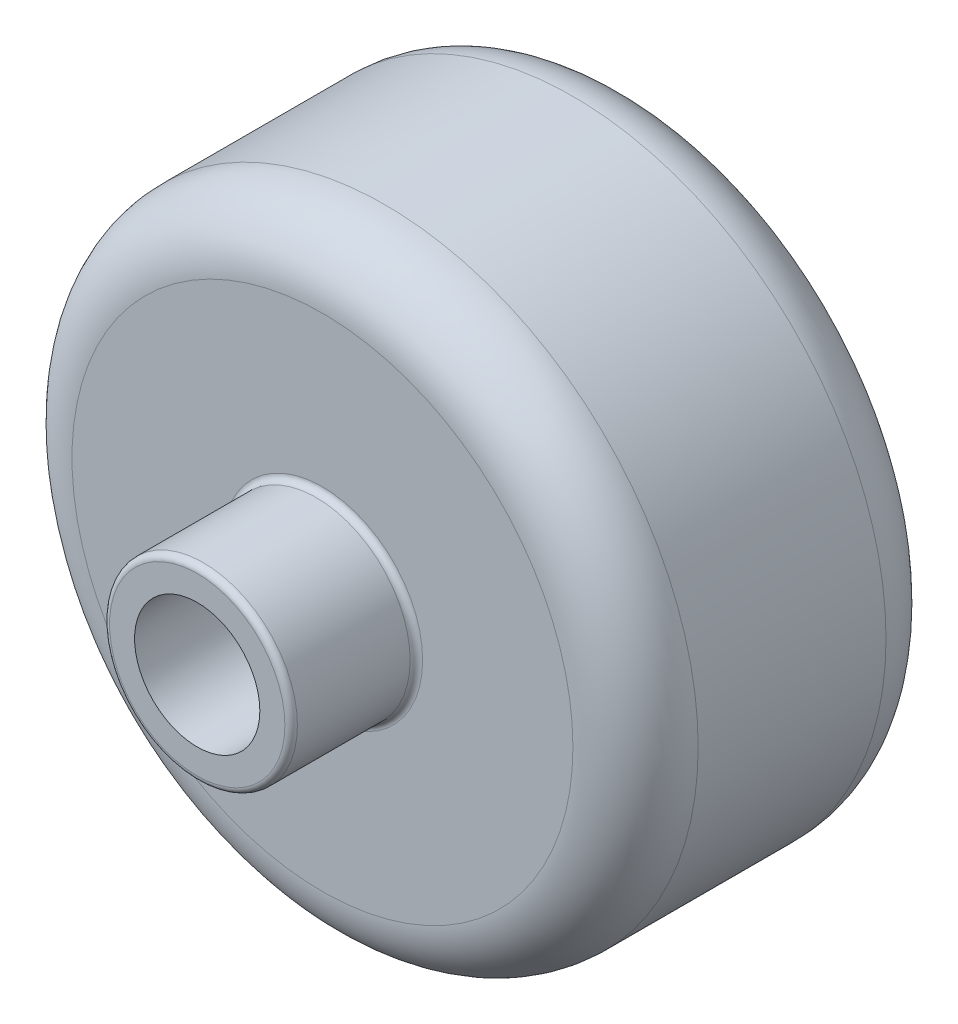
ISO-10303-21;
HEADER;
FILE_DESCRIPTION(('STEP AP214'),'2;1');
FILE_NAME('part.step','',(''),(''),'','','');
FILE_SCHEMA(('AUTOMOTIVE_DESIGN { 1 0 10303 214 1 1 1 1 }'));
ENDSEC;
DATA;
#1=APPLICATION_CONTEXT('core data for automotive mechanical design processes');
#2=APPLICATION_PROTOCOL_DEFINITION('international standard','automotive_design',2000,#1);
#3=PRODUCT_CONTEXT('',#1,'mechanical');
#4=PRODUCT('Part','Part','',(#3));
#5=PRODUCT_RELATED_PRODUCT_CATEGORY('part','',(#4));
#6=PRODUCT_DEFINITION_FORMATION('','',#4);
#7=PRODUCT_DEFINITION_CONTEXT('part definition',#1,'design');
#8=PRODUCT_DEFINITION('design','',#6,#7);
#9=PRODUCT_DEFINITION_SHAPE('','',#8);
#10=(LENGTH_UNIT() NAMED_UNIT(*) SI_UNIT(.MILLI.,.METRE.));
#11=(NAMED_UNIT(*) PLANE_ANGLE_UNIT() SI_UNIT($,.RADIAN.));
#12=(NAMED_UNIT(*) SI_UNIT($,.STERADIAN.) SOLID_ANGLE_UNIT());
#13=UNCERTAINTY_MEASURE_WITH_UNIT(LENGTH_MEASURE(1.E-05),#10,'distance_accuracy_value','');
#14=(GEOMETRIC_REPRESENTATION_CONTEXT(3) GLOBAL_UNCERTAINTY_ASSIGNED_CONTEXT((#13)) GLOBAL_UNIT_ASSIGNED_CONTEXT((#10,
#11,#12)) REPRESENTATION_CONTEXT('',''));
#15=CARTESIAN_POINT('',(0.,0.,0.));
#16=DIRECTION('',(0.,0.,1.));
#17=DIRECTION('',(1.,0.,0.));
#18=AXIS2_PLACEMENT_3D('',#15,#16,#17);
#19=CARTESIAN_POINT('',(0.,0.,0.));
#20=DIRECTION('',(0.,0.,1.));
#21=DIRECTION('',(1.,0.,0.));
#22=AXIS2_PLACEMENT_3D('',#19,#20,#21);
#23=PLANE('',#22);
#24=CARTESIAN_POINT('',(0.,0.,0.));
#25=DIRECTION('',(0.,0.,1.));
#26=DIRECTION('',(1.,0.,0.));
#27=AXIS2_PLACEMENT_3D('',#24,#25,#26);
#28=CIRCLE('',#27,2.);
#29=CARTESIAN_POINT('',(2.,0.,0.));
#30=VERTEX_POINT('',#29);
#31=EDGE_CURVE('E63',#30,#30,#28,.F.);
#32=ORIENTED_EDGE('',*,*,#31,.T.);
#33=EDGE_LOOP('',(#32));
#34=FACE_BOUND('',#33,.T.);
#35=CARTESIAN_POINT('',(0.,0.,0.));
#36=DIRECTION('',(0.,0.,1.));
#37=DIRECTION('',(1.,0.,0.));
#38=AXIS2_PLACEMENT_3D('',#35,#36,#37);
#39=CIRCLE('',#38,1.);
#40=CARTESIAN_POINT('',(1.,0.,0.));
#41=VERTEX_POINT('',#40);
#42=EDGE_CURVE('E66',#41,#41,#39,.T.);
#43=ORIENTED_EDGE('',*,*,#42,.T.);
#44=EDGE_LOOP('',(#43));
#45=FACE_BOUND('',#44,.T.);
#46=ADVANCED_FACE('F31',(#34,#45),#23,.F.);
#47=CARTESIAN_POINT('',(0.,0.,5.));
#48=DIRECTION('',(0.,0.,-1.));
#49=DIRECTION('',(-1.,0.,0.));
#50=AXIS2_PLACEMENT_3D('',#47,#48,#49);
#51=CYLINDRICAL_SURFACE('',#50,5.);
#52=CARTESIAN_POINT('',(0.,0.,4.));
#53=DIRECTION('',(0.,0.,1.));
#54=DIRECTION('',(1.,0.,0.));
#55=AXIS2_PLACEMENT_3D('',#52,#53,#54);
#56=CIRCLE('',#55,5.);
#57=CARTESIAN_POINT('',(5.,0.,4.));
#58=VERTEX_POINT('',#57);
#59=EDGE_CURVE('E51',#58,#58,#56,.F.);
#60=ORIENTED_EDGE('',*,*,#59,.T.);
#61=EDGE_LOOP('',(#60));
#62=FACE_BOUND('',#61,.T.);
#63=CARTESIAN_POINT('',(0.,0.,1.));
#64=DIRECTION('',(0.,0.,1.));
#65=DIRECTION('',(1.,0.,0.));
#66=AXIS2_PLACEMENT_3D('',#63,#64,#65);
#67=CIRCLE('',#66,5.);
#68=CARTESIAN_POINT('',(5.,0.,1.));
#69=VERTEX_POINT('',#68);
#70=EDGE_CURVE('E57',#69,#69,#67,.T.);
#71=ORIENTED_EDGE('',*,*,#70,.T.);
#72=EDGE_LOOP('',(#71));
#73=FACE_BOUND('',#72,.T.);
#74=ADVANCED_FACE('F104',(#62,#73),#51,.T.);
#75=CARTESIAN_POINT('',(0.,0.,5.));
#76=DIRECTION('',(0.,0.,1.));
#77=DIRECTION('',(1.,0.,0.));
#78=AXIS2_PLACEMENT_3D('',#75,#76,#77);
#79=PLANE('',#78);
#80=CARTESIAN_POINT('',(0.,0.,5.));
#81=DIRECTION('',(0.,0.,1.));
#82=DIRECTION('',(1.,0.,0.));
#83=AXIS2_PLACEMENT_3D('',#80,#81,#82);
#84=CIRCLE('',#83,1.6);
#85=CARTESIAN_POINT('',(1.6,0.,5.));
#86=VERTEX_POINT('',#85);
#87=EDGE_CURVE('E10',#86,#86,#84,.F.);
#88=ORIENTED_EDGE('',*,*,#87,.T.);
#89=EDGE_LOOP('',(#88));
#90=FACE_BOUND('',#89,.T.);
#91=CARTESIAN_POINT('',(0.,0.,5.));
#92=DIRECTION('',(0.,0.,1.));
#93=DIRECTION('',(1.,0.,0.));
#94=AXIS2_PLACEMENT_3D('',#91,#92,#93);
#95=CIRCLE('',#94,4.);
#96=CARTESIAN_POINT('',(4.,0.,5.));
#97=VERTEX_POINT('',#96);
#98=EDGE_CURVE('E54',#97,#97,#95,.T.);
#99=ORIENTED_EDGE('',*,*,#98,.T.);
#100=EDGE_LOOP('',(#99));
#101=FACE_BOUND('',#100,.T.);
#102=ADVANCED_FACE('F106',(#90,#101),#79,.T.);
#103=CARTESIAN_POINT('',(0.,0.,7.));
#104=DIRECTION('',(0.,0.,-1.));
#105=DIRECTION('',(-1.,0.,0.));
#106=AXIS2_PLACEMENT_3D('',#103,#104,#105);
#107=CYLINDRICAL_SURFACE('',#106,1.5);
#108=CARTESIAN_POINT('',(0.,0.,6.9));
#109=DIRECTION('',(0.,0.,1.));
#110=DIRECTION('',(1.,0.,0.));
#111=AXIS2_PLACEMENT_3D('',#108,#109,#110);
#112=CIRCLE('',#111,1.5);
#113=CARTESIAN_POINT('',(1.5,0.,6.9));
#114=VERTEX_POINT('',#113);
#115=EDGE_CURVE('E38',#114,#114,#112,.F.);
#116=ORIENTED_EDGE('',*,*,#115,.T.);
#117=EDGE_LOOP('',(#116));
#118=FACE_BOUND('',#117,.T.);
#119=CARTESIAN_POINT('',(0.,0.,5.1));
#120=DIRECTION('',(0.,0.,1.));
#121=DIRECTION('',(1.,0.,0.));
#122=AXIS2_PLACEMENT_3D('',#119,#120,#121);
#123=CIRCLE('',#122,1.5);
#124=CARTESIAN_POINT('',(1.5,0.,5.1));
#125=VERTEX_POINT('',#124);
#126=EDGE_CURVE('E42',#125,#125,#123,.T.);
#127=ORIENTED_EDGE('',*,*,#126,.T.);
#128=EDGE_LOOP('',(#127));
#129=FACE_BOUND('',#128,.T.);
#130=ADVANCED_FACE('F113',(#118,#129),#107,.T.);
#131=CARTESIAN_POINT('',(0.,0.,7.));
#132=DIRECTION('',(0.,0.,1.));
#133=DIRECTION('',(1.,0.,0.));
#134=AXIS2_PLACEMENT_3D('',#131,#132,#133);
#135=PLANE('',#134);
#136=CARTESIAN_POINT('',(0.,0.,7.));
#137=DIRECTION('',(0.,0.,1.));
#138=DIRECTION('',(1.,0.,0.));
#139=AXIS2_PLACEMENT_3D('',#136,#137,#138);
#140=CIRCLE('',#139,1.4);
#141=CARTESIAN_POINT('',(1.4,0.,7.));
#142=VERTEX_POINT('',#141);
#143=EDGE_CURVE('E46',#142,#142,#140,.T.);
#144=ORIENTED_EDGE('',*,*,#143,.T.);
#145=EDGE_LOOP('',(#144));
#146=FACE_BOUND('',#145,.T.);
#147=CARTESIAN_POINT('',(0.,0.,7.));
#148=DIRECTION('',(0.,0.,1.));
#149=DIRECTION('',(1.,0.,0.));
#150=AXIS2_PLACEMENT_3D('',#147,#148,#149);
#151=CIRCLE('',#150,1.);
#152=CARTESIAN_POINT('',(1.,0.,7.));
#153=VERTEX_POINT('',#152);
#154=EDGE_CURVE('E67',#153,#153,#151,.T.);
#155=ORIENTED_EDGE('',*,*,#154,.F.);
#156=EDGE_LOOP('',(#155));
#157=FACE_BOUND('',#156,.T.);
#158=ADVANCED_FACE('F133',(#146,#157),#135,.T.);
#159=CARTESIAN_POINT('',(0.,0.,0.));
#160=DIRECTION('',(0.,0.,1.));
#161=DIRECTION('',(1.,0.,0.));
#162=AXIS2_PLACEMENT_3D('',#159,#160,#161);
#163=CYLINDRICAL_SURFACE('',#162,1.);
#164=ORIENTED_EDGE('',*,*,#42,.F.);
#165=EDGE_LOOP('',(#164));
#166=FACE_BOUND('',#165,.T.);
#167=ORIENTED_EDGE('',*,*,#154,.T.);
#168=EDGE_LOOP('',(#167));
#169=FACE_BOUND('',#168,.T.);
#170=ADVANCED_FACE('F136',(#166,#169),#163,.F.);
#171=CARTESIAN_POINT('',(0.,0.,2.));
#172=DIRECTION('',(0.,0.,-1.));
#173=DIRECTION('',(-1.,0.,0.));
#174=AXIS2_PLACEMENT_3D('',#171,#172,#173);
#175=CYLINDRICAL_SURFACE('',#174,3.);
#176=CARTESIAN_POINT('',(0.,0.,1.));
#177=DIRECTION('',(0.,0.,1.));
#178=DIRECTION('',(1.,0.,0.));
#179=AXIS2_PLACEMENT_3D('',#176,#177,#178);
#180=CIRCLE('',#179,3.);
#181=CARTESIAN_POINT('',(3.,0.,1.));
#182=VERTEX_POINT('',#181);
#183=EDGE_CURVE('E60',#182,#182,#180,.T.);
#184=ORIENTED_EDGE('',*,*,#183,.T.);
#185=EDGE_LOOP('',(#184));
#186=FACE_BOUND('',#185,.T.);
#187=CARTESIAN_POINT('',(0.,0.,2.));
#188=DIRECTION('',(0.,0.,-1.));
#189=DIRECTION('',(-1.,0.,0.));
#190=AXIS2_PLACEMENT_3D('',#187,#188,#189);
#191=CIRCLE('',#190,3.);
#192=CARTESIAN_POINT('',(-3.,0.,2.));
#193=VERTEX_POINT('',#192);
#194=EDGE_CURVE('E76',#193,#193,#191,.T.);
#195=ORIENTED_EDGE('',*,*,#194,.T.);
#196=EDGE_LOOP('',(#195));
#197=FACE_BOUND('',#196,.T.);
#198=ADVANCED_FACE('F82',(#186,#197),#175,.T.);
#199=CARTESIAN_POINT('',(0.,0.,2.));
#200=DIRECTION('',(0.,0.,-1.));
#201=DIRECTION('',(-1.,0.,0.));
#202=AXIS2_PLACEMENT_3D('',#199,#200,#201);
#203=CYLINDRICAL_SURFACE('',#202,4.);
#204=CARTESIAN_POINT('',(0.,0.,2.));
#205=DIRECTION('',(0.,0.,-1.));
#206=DIRECTION('',(-1.,0.,0.));
#207=AXIS2_PLACEMENT_3D('',#204,#205,#206);
#208=CIRCLE('',#207,4.);
#209=CARTESIAN_POINT('',(-4.,0.,2.));
#210=VERTEX_POINT('',#209);
#211=EDGE_CURVE('E70',#210,#210,#208,.T.);
#212=ORIENTED_EDGE('',*,*,#211,.F.);
#213=EDGE_LOOP('',(#212));
#214=FACE_BOUND('',#213,.T.);
#215=CARTESIAN_POINT('',(0.,0.,0.));
#216=DIRECTION('',(0.,0.,-1.));
#217=DIRECTION('',(-1.,0.,0.));
#218=AXIS2_PLACEMENT_3D('',#215,#216,#217);
#219=CIRCLE('',#218,4.);
#220=CARTESIAN_POINT('',(-4.,0.,0.));
#221=VERTEX_POINT('',#220);
#222=EDGE_CURVE('E73',#221,#221,#219,.T.);
#223=ORIENTED_EDGE('',*,*,#222,.T.);
#224=EDGE_LOOP('',(#223));
#225=FACE_BOUND('',#224,.T.);
#226=ADVANCED_FACE('F88',(#214,#225),#203,.F.);
#227=CARTESIAN_POINT('',(0.,0.,2.));
#228=DIRECTION('',(0.,0.,-1.));
#229=DIRECTION('',(-1.,0.,0.));
#230=AXIS2_PLACEMENT_3D('',#227,#228,#229);
#231=PLANE('',#230);
#232=ORIENTED_EDGE('',*,*,#194,.F.);
#233=EDGE_LOOP('',(#232));
#234=FACE_BOUND('',#233,.T.);
#235=ORIENTED_EDGE('',*,*,#211,.T.);
#236=EDGE_LOOP('',(#235));
#237=FACE_BOUND('',#236,.T.);
#238=ADVANCED_FACE('F84',(#234,#237),#231,.T.);
#239=CARTESIAN_POINT('',(0.,0.,1.));
#240=DIRECTION('',(0.,0.,1.));
#241=DIRECTION('',(1.,0.,0.));
#242=AXIS2_PLACEMENT_3D('',#239,#240,#241);
#243=TOROIDAL_SURFACE('',#242,2.,1.);
#244=ORIENTED_EDGE('',*,*,#183,.F.);
#245=EDGE_LOOP('',(#244));
#246=FACE_BOUND('',#245,.T.);
#247=ORIENTED_EDGE('',*,*,#31,.F.);
#248=EDGE_LOOP('',(#247));
#249=FACE_BOUND('',#248,.T.);
#250=ADVANCED_FACE('F87',(#246,#249),#243,.T.);
#251=CARTESIAN_POINT('',(0.,0.,1.));
#252=DIRECTION('',(0.,0.,1.));
#253=DIRECTION('',(1.,0.,0.));
#254=AXIS2_PLACEMENT_3D('',#251,#252,#253);
#255=TOROIDAL_SURFACE('',#254,4.,1.);
#256=ORIENTED_EDGE('',*,*,#222,.F.);
#257=EDGE_LOOP('',(#256));
#258=FACE_BOUND('',#257,.T.);
#259=ORIENTED_EDGE('',*,*,#70,.F.);
#260=EDGE_LOOP('',(#259));
#261=FACE_BOUND('',#260,.T.);
#262=ADVANCED_FACE('F97',(#258,#261),#255,.T.);
#263=CARTESIAN_POINT('',(0.,0.,4.));
#264=DIRECTION('',(0.,0.,1.));
#265=DIRECTION('',(1.,0.,0.));
#266=AXIS2_PLACEMENT_3D('',#263,#264,#265);
#267=TOROIDAL_SURFACE('',#266,4.,1.);
#268=ORIENTED_EDGE('',*,*,#59,.F.);
#269=EDGE_LOOP('',(#268));
#270=FACE_BOUND('',#269,.T.);
#271=ORIENTED_EDGE('',*,*,#98,.F.);
#272=EDGE_LOOP('',(#271));
#273=FACE_BOUND('',#272,.T.);
#274=ADVANCED_FACE('F100',(#270,#273),#267,.T.);
#275=CARTESIAN_POINT('',(0.,0.,6.9));
#276=DIRECTION('',(0.,0.,1.));
#277=DIRECTION('',(1.,0.,0.));
#278=AXIS2_PLACEMENT_3D('',#275,#276,#277);
#279=TOROIDAL_SURFACE('',#278,1.4,0.1);
#280=ORIENTED_EDGE('',*,*,#115,.F.);
#281=EDGE_LOOP('',(#280));
#282=FACE_BOUND('',#281,.T.);
#283=ORIENTED_EDGE('',*,*,#143,.F.);
#284=EDGE_LOOP('',(#283));
#285=FACE_BOUND('',#284,.T.);
#286=ADVANCED_FACE('F122',(#282,#285),#279,.T.);
#287=CARTESIAN_POINT('',(0.,0.,5.1));
#288=DIRECTION('',(0.,0.,1.));
#289=DIRECTION('',(1.,0.,0.));
#290=AXIS2_PLACEMENT_3D('',#287,#288,#289);
#291=TOROIDAL_SURFACE('',#290,1.6,0.1);
#292=ORIENTED_EDGE('',*,*,#87,.F.);
#293=EDGE_LOOP('',(#292));
#294=FACE_BOUND('',#293,.T.);
#295=ORIENTED_EDGE('',*,*,#126,.F.);
#296=EDGE_LOOP('',(#295));
#297=FACE_BOUND('',#296,.T.);
#298=ADVANCED_FACE('F33',(#294,#297),#291,.F.);
#299=CLOSED_SHELL('',(#46,#74,#102,#130,#158,#170,#198,#226,#238,#250,#262,#274,#286,#298));
#300=MANIFOLD_SOLID_BREP('B2',#299);
#301=ADVANCED_BREP_SHAPE_REPRESENTATION('',(#18,#300),#14);
#302=SHAPE_DEFINITION_REPRESENTATION(#9,#301);
ENDSEC;
END-ISO-10303-21;
